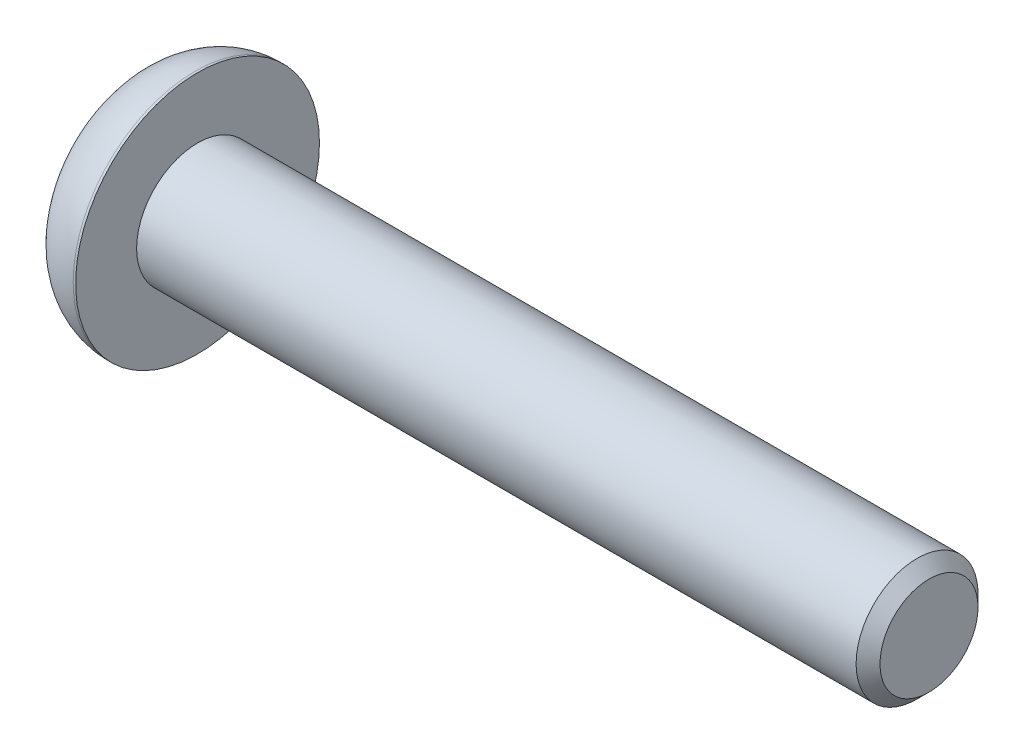
ISO-10303-21;
HEADER;
FILE_DESCRIPTION(('STEP AP214'),'2;1');
FILE_NAME('part.step','',(''),(''),'','','');
FILE_SCHEMA(('AUTOMOTIVE_DESIGN { 1 0 10303 214 1 1 1 1 }'));
ENDSEC;
DATA;
#1=APPLICATION_CONTEXT('core data for automotive mechanical design processes');
#2=APPLICATION_PROTOCOL_DEFINITION('international standard','automotive_design',2000,#1);
#3=PRODUCT_CONTEXT('',#1,'mechanical');
#4=PRODUCT('Part','Part','',(#3));
#5=PRODUCT_RELATED_PRODUCT_CATEGORY('part','',(#4));
#6=PRODUCT_DEFINITION_FORMATION('','',#4);
#7=PRODUCT_DEFINITION_CONTEXT('part definition',#1,'design');
#8=PRODUCT_DEFINITION('design','',#6,#7);
#9=PRODUCT_DEFINITION_SHAPE('','',#8);
#10=(LENGTH_UNIT() NAMED_UNIT(*) SI_UNIT(.MILLI.,.METRE.));
#11=(NAMED_UNIT(*) PLANE_ANGLE_UNIT() SI_UNIT($,.RADIAN.));
#12=(NAMED_UNIT(*) SI_UNIT($,.STERADIAN.) SOLID_ANGLE_UNIT());
#13=UNCERTAINTY_MEASURE_WITH_UNIT(LENGTH_MEASURE(1.E-05),#10,'distance_accuracy_value','');
#14=(GEOMETRIC_REPRESENTATION_CONTEXT(3) GLOBAL_UNCERTAINTY_ASSIGNED_CONTEXT((#13)) GLOBAL_UNIT_ASSIGNED_CONTEXT((#10,
#11,#12)) REPRESENTATION_CONTEXT('',''));
#15=CARTESIAN_POINT('',(0.,0.,0.));
#16=DIRECTION('',(0.,0.,1.));
#17=DIRECTION('',(1.,0.,0.));
#18=AXIS2_PLACEMENT_3D('',#15,#16,#17);
#19=CARTESIAN_POINT('',(1.82,0.,0.));
#20=DIRECTION('',(-1.,0.,0.));
#21=DIRECTION('',(0.,0.,1.));
#22=AXIS2_PLACEMENT_3D('',#19,#20,#21);
#23=PLANE('',#22);
#24=CARTESIAN_POINT('',(1.82,0.,0.));
#25=DIRECTION('',(-1.,0.,0.));
#26=DIRECTION('',(0.,0.,1.));
#27=AXIS2_PLACEMENT_3D('',#24,#25,#26);
#28=CIRCLE('',#27,1.49999999999999);
#29=CARTESIAN_POINT('',(1.82,0.,1.49999999999999));
#30=VERTEX_POINT('',#29);
#31=CARTESIAN_POINT('',(1.82,1.29903810567665,0.749999999999996));
#32=VERTEX_POINT('',#31);
#33=EDGE_CURVE('E120',#30,#32,#28,.T.);
#34=ORIENTED_EDGE('',*,*,#33,.F.);
#35=DIRECTION('',(0.,1.,0.));
#36=VECTOR('',#35,1.);
#37=CARTESIAN_POINT('',(1.82,-0.866025403784439,1.5));
#38=LINE('',#37,#36);
#39=CARTESIAN_POINT('',(1.82,0.866025403784439,1.5));
#40=VERTEX_POINT('',#39);
#41=EDGE_CURVE('E131',#30,#40,#38,.T.);
#42=ORIENTED_EDGE('',*,*,#41,.T.);
#43=DIRECTION('',(0.,0.500000000000001,-0.866025403784438));
#44=VECTOR('',#43,1.);
#45=CARTESIAN_POINT('',(1.82,0.866025403784439,1.5));
#46=LINE('',#45,#44);
#47=EDGE_CURVE('E137',#40,#32,#46,.T.);
#48=ORIENTED_EDGE('',*,*,#47,.T.);
#49=EDGE_LOOP('',(#34,#42,#48));
#50=FACE_BOUND('',#49,.T.);
#51=ADVANCED_FACE('F37',(#50),#23,.T.);
#52=CARTESIAN_POINT('',(1.82,1.29903810567665,-0.749999999999996));
#53=VERTEX_POINT('',#52);
#54=EDGE_CURVE('E125',#32,#53,#28,.T.);
#55=ORIENTED_EDGE('',*,*,#54,.F.);
#56=CARTESIAN_POINT('',(1.82,1.73205080756888,0.));
#57=VERTEX_POINT('',#56);
#58=EDGE_CURVE('E136',#32,#57,#46,.T.);
#59=ORIENTED_EDGE('',*,*,#58,.T.);
#60=DIRECTION('',(0.,-0.500000000000001,-0.866025403784438));
#61=VECTOR('',#60,1.);
#62=CARTESIAN_POINT('',(1.82,1.73205080756888,0.));
#63=LINE('',#62,#61);
#64=EDGE_CURVE('E141',#57,#53,#63,.T.);
#65=ORIENTED_EDGE('',*,*,#64,.T.);
#66=EDGE_LOOP('',(#55,#59,#65));
#67=FACE_BOUND('',#66,.T.);
#68=ADVANCED_FACE('F204',(#67),#23,.T.);
#69=CARTESIAN_POINT('',(1.82,0.,-1.49999999999999));
#70=VERTEX_POINT('',#69);
#71=EDGE_CURVE('E265',#53,#70,#28,.T.);
#72=ORIENTED_EDGE('',*,*,#71,.F.);
#73=CARTESIAN_POINT('',(1.82,0.86602540378444,-1.5));
#74=VERTEX_POINT('',#73);
#75=EDGE_CURVE('E140',#53,#74,#63,.T.);
#76=ORIENTED_EDGE('',*,*,#75,.T.);
#77=DIRECTION('',(0.,-1.,0.));
#78=VECTOR('',#77,1.);
#79=CARTESIAN_POINT('',(1.82,0.86602540378444,-1.5));
#80=LINE('',#79,#78);
#81=EDGE_CURVE('E145',#74,#70,#80,.T.);
#82=ORIENTED_EDGE('',*,*,#81,.T.);
#83=EDGE_LOOP('',(#72,#76,#82));
#84=FACE_BOUND('',#83,.T.);
#85=ADVANCED_FACE('F210',(#84),#23,.T.);
#86=CARTESIAN_POINT('',(1.82,-1.29903810567665,-0.749999999999994));
#87=VERTEX_POINT('',#86);
#88=EDGE_CURVE('E237',#70,#87,#28,.T.);
#89=ORIENTED_EDGE('',*,*,#88,.F.);
#90=CARTESIAN_POINT('',(1.82,-0.866025403784439,-1.5));
#91=VERTEX_POINT('',#90);
#92=EDGE_CURVE('E144',#70,#91,#80,.T.);
#93=ORIENTED_EDGE('',*,*,#92,.T.);
#94=DIRECTION('',(0.,-0.5,0.866025403784439));
#95=VECTOR('',#94,1.);
#96=CARTESIAN_POINT('',(1.82,-0.866025403784439,-1.5));
#97=LINE('',#96,#95);
#98=EDGE_CURVE('E149',#91,#87,#97,.T.);
#99=ORIENTED_EDGE('',*,*,#98,.T.);
#100=EDGE_LOOP('',(#89,#93,#99));
#101=FACE_BOUND('',#100,.T.);
#102=ADVANCED_FACE('F225',(#101),#23,.T.);
#103=CARTESIAN_POINT('',(1.82,-1.29903810567666,0.750000000000002));
#104=VERTEX_POINT('',#103);
#105=EDGE_CURVE('E52',#87,#104,#28,.T.);
#106=ORIENTED_EDGE('',*,*,#105,.F.);
#107=CARTESIAN_POINT('',(1.82,-1.73205080756888,0.));
#108=VERTEX_POINT('',#107);
#109=EDGE_CURVE('E148',#87,#108,#97,.T.);
#110=ORIENTED_EDGE('',*,*,#109,.T.);
#111=DIRECTION('',(0.,0.500000000000001,0.866025403784438));
#112=VECTOR('',#111,1.);
#113=CARTESIAN_POINT('',(1.82,-1.73205080756888,0.));
#114=LINE('',#113,#112);
#115=EDGE_CURVE('E128',#108,#104,#114,.T.);
#116=ORIENTED_EDGE('',*,*,#115,.T.);
#117=EDGE_LOOP('',(#106,#110,#116));
#118=FACE_BOUND('',#117,.T.);
#119=ADVANCED_FACE('F217',(#118),#23,.T.);
#120=CARTESIAN_POINT('',(0.,0.,0.));
#121=DIRECTION('',(1.,0.,0.));
#122=DIRECTION('',(0.,0.,-1.));
#123=AXIS2_PLACEMENT_3D('',#120,#121,#122);
#124=CYLINDRICAL_SURFACE('',#123,5.);
#125=CARTESIAN_POINT('',(2.7,0.,0.));
#126=DIRECTION('',(-1.,0.,0.));
#127=DIRECTION('',(0.,0.,1.));
#128=AXIS2_PLACEMENT_3D('',#125,#126,#127);
#129=CIRCLE('',#128,5.);
#130=CARTESIAN_POINT('',(2.7,0.,5.));
#131=VERTEX_POINT('',#130);
#132=EDGE_CURVE('E45',#131,#131,#129,.F.);
#133=ORIENTED_EDGE('',*,*,#132,.T.);
#134=EDGE_LOOP('',(#133));
#135=FACE_BOUND('',#134,.T.);
#136=CARTESIAN_POINT('',(2.8,0.,0.));
#137=DIRECTION('',(1.,0.,0.));
#138=DIRECTION('',(0.,0.,-1.));
#139=AXIS2_PLACEMENT_3D('',#136,#137,#138);
#140=CIRCLE('',#139,5.);
#141=CARTESIAN_POINT('',(2.8,0.,-5.));
#142=VERTEX_POINT('',#141);
#143=EDGE_CURVE('E169',#142,#142,#140,.T.);
#144=ORIENTED_EDGE('',*,*,#143,.F.);
#145=EDGE_LOOP('',(#144));
#146=FACE_BOUND('',#145,.T.);
#147=ADVANCED_FACE('F192',(#135,#146),#124,.T.);
#148=CARTESIAN_POINT('',(0.,5.,0.));
#149=DIRECTION('',(-1.,0.,0.));
#150=DIRECTION('',(0.,0.,1.));
#151=AXIS2_PLACEMENT_3D('',#148,#149,#150);
#152=PLANE('',#151);
#153=CARTESIAN_POINT('',(0.,0.,0.));
#154=DIRECTION('',(-1.,0.,0.));
#155=DIRECTION('',(0.,0.,1.));
#156=AXIS2_PLACEMENT_3D('',#153,#154,#155);
#157=CIRCLE('',#156,2.3);
#158=CARTESIAN_POINT('',(0.,0.,2.3));
#159=VERTEX_POINT('',#158);
#160=EDGE_CURVE('E11',#159,#159,#157,.T.);
#161=ORIENTED_EDGE('',*,*,#160,.T.);
#162=EDGE_LOOP('',(#161));
#163=FACE_BOUND('',#162,.T.);
#164=DIRECTION('',(0.,0.500000000000001,0.866025403784438));
#165=VECTOR('',#164,1.);
#166=CARTESIAN_POINT('',(0.,-1.73205080756888,0.));
#167=LINE('',#166,#165);
#168=CARTESIAN_POINT('',(0.,-1.73205080756888,0.));
#169=VERTEX_POINT('',#168);
#170=CARTESIAN_POINT('',(0.,-0.866025403784439,1.5));
#171=VERTEX_POINT('',#170);
#172=EDGE_CURVE('E60',#169,#171,#167,.T.);
#173=ORIENTED_EDGE('',*,*,#172,.F.);
#174=DIRECTION('',(0.,-0.5,0.866025403784439));
#175=VECTOR('',#174,1.);
#176=CARTESIAN_POINT('',(0.,-0.866025403784439,-1.5));
#177=LINE('',#176,#175);
#178=CARTESIAN_POINT('',(0.,-0.866025403784439,-1.5));
#179=VERTEX_POINT('',#178);
#180=EDGE_CURVE('E164',#179,#169,#177,.T.);
#181=ORIENTED_EDGE('',*,*,#180,.F.);
#182=DIRECTION('',(0.,-1.,0.));
#183=VECTOR('',#182,1.);
#184=CARTESIAN_POINT('',(0.,0.86602540378444,-1.5));
#185=LINE('',#184,#183);
#186=CARTESIAN_POINT('',(0.,0.86602540378444,-1.5));
#187=VERTEX_POINT('',#186);
#188=EDGE_CURVE('E161',#187,#179,#185,.T.);
#189=ORIENTED_EDGE('',*,*,#188,.F.);
#190=DIRECTION('',(0.,-0.500000000000001,-0.866025403784438));
#191=VECTOR('',#190,1.);
#192=CARTESIAN_POINT('',(0.,1.73205080756888,0.));
#193=LINE('',#192,#191);
#194=CARTESIAN_POINT('',(0.,1.73205080756888,0.));
#195=VERTEX_POINT('',#194);
#196=EDGE_CURVE('E158',#195,#187,#193,.T.);
#197=ORIENTED_EDGE('',*,*,#196,.F.);
#198=DIRECTION('',(0.,0.500000000000001,-0.866025403784438));
#199=VECTOR('',#198,1.);
#200=CARTESIAN_POINT('',(0.,0.866025403784439,1.5));
#201=LINE('',#200,#199);
#202=CARTESIAN_POINT('',(0.,0.866025403784439,1.5));
#203=VERTEX_POINT('',#202);
#204=EDGE_CURVE('E155',#203,#195,#201,.T.);
#205=ORIENTED_EDGE('',*,*,#204,.F.);
#206=DIRECTION('',(0.,1.,0.));
#207=VECTOR('',#206,1.);
#208=CARTESIAN_POINT('',(0.,-0.866025403784439,1.5));
#209=LINE('',#208,#207);
#210=EDGE_CURVE('E122',#171,#203,#209,.T.);
#211=ORIENTED_EDGE('',*,*,#210,.F.);
#212=EDGE_LOOP('',(#173,#181,#189,#197,#205,#211));
#213=FACE_BOUND('',#212,.T.);
#214=ADVANCED_FACE('F231',(#163,#213),#152,.T.);
#215=CARTESIAN_POINT('',(2.8,0.,0.));
#216=DIRECTION('',(1.,0.,0.));
#217=DIRECTION('',(0.,0.,-1.));
#218=AXIS2_PLACEMENT_3D('',#215,#216,#217);
#219=PLANE('',#218);
#220=CARTESIAN_POINT('',(2.8,0.,0.));
#221=DIRECTION('',(1.,0.,0.));
#222=DIRECTION('',(0.,0.,-1.));
#223=AXIS2_PLACEMENT_3D('',#220,#221,#222);
#224=CIRCLE('',#223,2.5);
#225=CARTESIAN_POINT('',(2.8,0.,2.5));
#226=VERTEX_POINT('',#225);
#227=EDGE_CURVE('E179',#226,#226,#224,.T.);
#228=ORIENTED_EDGE('',*,*,#227,.F.);
#229=EDGE_LOOP('',(#228));
#230=FACE_BOUND('',#229,.T.);
#231=ORIENTED_EDGE('',*,*,#143,.T.);
#232=EDGE_LOOP('',(#231));
#233=FACE_BOUND('',#232,.T.);
#234=ADVANCED_FACE('F289',(#230,#233),#219,.T.);
#235=CARTESIAN_POINT('',(32.8,0.,0.));
#236=DIRECTION('',(-1.,0.,0.));
#237=DIRECTION('',(0.,0.,1.));
#238=AXIS2_PLACEMENT_3D('',#235,#236,#237);
#239=CYLINDRICAL_SURFACE('',#238,2.5);
#240=CARTESIAN_POINT('',(32.30949999996,0.,0.));
#241=DIRECTION('',(1.,0.,0.));
#242=DIRECTION('',(0.,0.,-1.));
#243=AXIS2_PLACEMENT_3D('',#240,#241,#242);
#244=CIRCLE('',#243,2.5);
#245=CARTESIAN_POINT('',(32.30949999996,0.,2.5));
#246=VERTEX_POINT('',#245);
#247=EDGE_CURVE('E187',#246,#246,#244,.F.);
#248=CARTESIAN_POINT('',(32.30949999996,0.,2.5));
#249=CARTESIAN_POINT('',(32.0021093749604,0.,2.5));
#250=CARTESIAN_POINT('',(31.6947187499608,0.,2.5));
#251=CARTESIAN_POINT('',(31.0799374999616,0.,2.5));
#252=CARTESIAN_POINT('',(30.772546874962,0.,2.5));
#253=CARTESIAN_POINT('',(30.1577656249629,0.,2.5));
#254=CARTESIAN_POINT('',(29.8503749999633,0.,2.5));
#255=CARTESIAN_POINT('',(29.2355937499641,0.,2.5));
#256=CARTESIAN_POINT('',(28.9282031249646,0.,2.5));
#257=CARTESIAN_POINT('',(28.3134218749654,0.,2.5));
#258=CARTESIAN_POINT('',(28.0060312499658,0.,2.5));
#259=CARTESIAN_POINT('',(27.3912499999666,0.,2.5));
#260=CARTESIAN_POINT('',(27.0838593749671,0.,2.5));
#261=CARTESIAN_POINT('',(26.4690781249679,0.,2.5));
#262=CARTESIAN_POINT('',(26.1616874999683,0.,2.5));
#263=CARTESIAN_POINT('',(25.5469062499691,0.,2.5));
#264=CARTESIAN_POINT('',(25.2395156249696,0.,2.5));
#265=CARTESIAN_POINT('',(24.6247343749704,0.,2.5));
#266=CARTESIAN_POINT('',(24.3173437499708,0.,2.5));
#267=CARTESIAN_POINT('',(23.7025624999716,0.,2.5));
#268=CARTESIAN_POINT('',(23.3951718749721,0.,2.5));
#269=CARTESIAN_POINT('',(22.7803906249729,0.,2.5));
#270=CARTESIAN_POINT('',(22.4729999999733,0.,2.5));
#271=CARTESIAN_POINT('',(21.8582187499741,0.,2.5));
#272=CARTESIAN_POINT('',(21.5508281249746,0.,2.5));
#273=CARTESIAN_POINT('',(20.9360468749754,0.,2.5));
#274=CARTESIAN_POINT('',(20.6286562499758,0.,2.5));
#275=CARTESIAN_POINT('',(20.0138749999766,0.,2.5));
#276=CARTESIAN_POINT('',(19.7064843749771,0.,2.5));
#277=CARTESIAN_POINT('',(19.0917031249779,0.,2.5));
#278=CARTESIAN_POINT('',(18.7843124999783,0.,2.5));
#279=CARTESIAN_POINT('',(18.1695312499791,0.,2.5));
#280=CARTESIAN_POINT('',(17.8621406249796,0.,2.5));
#281=CARTESIAN_POINT('',(17.2473593749804,0.,2.5));
#282=CARTESIAN_POINT('',(16.9399687499808,0.,2.5));
#283=CARTESIAN_POINT('',(16.3251874999817,0.,2.5));
#284=CARTESIAN_POINT('',(16.0177968749821,0.,2.5));
#285=CARTESIAN_POINT('',(15.4030156249829,0.,2.5));
#286=CARTESIAN_POINT('',(15.0956249999833,0.,2.5));
#287=CARTESIAN_POINT('',(14.4808437499842,0.,2.5));
#288=CARTESIAN_POINT('',(14.1734531249846,0.,2.5));
#289=CARTESIAN_POINT('',(13.5586718749854,0.,2.5));
#290=CARTESIAN_POINT('',(13.2512812499858,0.,2.5));
#291=CARTESIAN_POINT('',(12.6364999999867,0.,2.5));
#292=CARTESIAN_POINT('',(12.3291093749871,0.,2.5));
#293=CARTESIAN_POINT('',(11.7143281249879,0.,2.5));
#294=CARTESIAN_POINT('',(11.4069374999883,0.,2.5));
#295=CARTESIAN_POINT('',(10.7921562499892,0.,2.5));
#296=CARTESIAN_POINT('',(10.4847656249896,0.,2.5));
#297=CARTESIAN_POINT('',(9.86998437499041,0.,2.5));
#298=CARTESIAN_POINT('',(9.56259374999083,0.,2.5));
#299=CARTESIAN_POINT('',(8.94781249999166,0.,2.5));
#300=CARTESIAN_POINT('',(8.64042187499208,0.,2.5));
#301=CARTESIAN_POINT('',(8.02564062499291,0.,2.5));
#302=CARTESIAN_POINT('',(7.71824999999333,0.,2.5));
#303=CARTESIAN_POINT('',(7.10346874999416,0.,2.5));
#304=CARTESIAN_POINT('',(6.79607812499458,0.,2.5));
#305=CARTESIAN_POINT('',(6.18129687499541,0.,2.5));
#306=CARTESIAN_POINT('',(5.87390624999583,0.,2.5));
#307=CARTESIAN_POINT('',(5.25912499999666,0.,2.5));
#308=CARTESIAN_POINT('',(4.95173437499708,0.,2.5));
#309=CARTESIAN_POINT('',(4.33695312499791,0.,2.5));
#310=CARTESIAN_POINT('',(4.02956249999833,0.,2.5));
#311=CARTESIAN_POINT('',(3.41478124999917,0.,2.5));
#312=CARTESIAN_POINT('',(3.10739062499958,0.,2.5));
#313=CARTESIAN_POINT('',(2.8,0.,2.5));
#314=B_SPLINE_CURVE_WITH_KNOTS('',3,(#248,#249,#250,#251,#252,#253,#254,#255,#256,#257,#258,
#259,#260,#261,#262,#263,#264,#265,#266,#267,#268,#269,#270,#271,#272,#273,#274,#275,#276,#277,
#278,#279,#280,#281,#282,#283,#284,#285,#286,#287,#288,#289,#290,#291,#292,#293,#294,#295,#296,
#297,#298,#299,#300,#301,#302,#303,#304,#305,#306,#307,#308,#309,#310,#311,#312,#313),
.UNSPECIFIED.,.F.,.F.,(4,2,2,2,2,2,2,2,2,2,2,2,2,2,2,2,2,2,2,2,2,2,2,2,2,2,2,2,2,2,2,2,4),(0.,
0.922171874998746,1.84434374999749,2.76651562499624,3.68868749999499,4.61085937499374,
5.53303124999249,6.45520312499124,7.37737499998999,8.29954687498874,9.22171874998749,
10.1438906249862,11.066062499985,11.9882343749837,12.9104062499825,13.8325781249812,
14.75474999998,15.6769218749787,16.5990937499775,17.5212656249762,18.443437499975,
19.3656093749737,20.2877812499725,21.2099531249712,22.13212499997,23.0542968749687,
23.9764687499675,24.8986406249662,25.820812499965,26.7429843749637,27.6651562499625,
28.5873281249612,29.50949999996),.UNSPECIFIED.);
#315=EDGE_CURVE('BSEAM285',#246,#226,#314,.T.);
#316=ORIENTED_EDGE('',*,*,#247,.T.);
#317=ORIENTED_EDGE('',*,*,#227,.T.);
#318=ORIENTED_EDGE('',*,*,#315,.T.);
#319=ORIENTED_EDGE('',*,*,#315,.F.);
#320=EDGE_LOOP('',(#316,#318,#317,#319));
#321=FACE_BOUND('',#320,.T.);
#322=ADVANCED_FACE('F285',(#321),#239,.T.);
#323=CARTESIAN_POINT('',(32.8,0.,0.));
#324=DIRECTION('',(1.,0.,0.));
#325=DIRECTION('',(0.,0.,-1.));
#326=AXIS2_PLACEMENT_3D('',#323,#324,#325);
#327=PLANE('',#326);
#328=CARTESIAN_POINT('',(32.8,0.,0.));
#329=DIRECTION('',(1.,0.,0.));
#330=DIRECTION('',(0.,0.,-1.));
#331=AXIS2_PLACEMENT_3D('',#328,#329,#330);
#332=CIRCLE('',#331,2.00950000001682);
#333=CARTESIAN_POINT('',(32.8,0.,-2.00950000001682));
#334=VERTEX_POINT('',#333);
#335=EDGE_CURVE('E184',#334,#334,#332,.T.);
#336=ORIENTED_EDGE('',*,*,#335,.T.);
#337=EDGE_LOOP('',(#336));
#338=FACE_BOUND('',#337,.T.);
#339=ADVANCED_FACE('F282',(#338),#327,.T.);
#340=CARTESIAN_POINT('',(1.82,-1.73205080756888,0.));
#341=DIRECTION('',(0.,-0.866025403784438,0.500000000000001));
#342=DIRECTION('',(0.,-0.500000000000001,-0.866025403784438));
#343=AXIS2_PLACEMENT_3D('',#340,#341,#342);
#344=PLANE('',#343);
#345=ORIENTED_EDGE('',*,*,#172,.T.);
#346=DIRECTION('',(-1.,0.,0.));
#347=VECTOR('',#346,1.);
#348=CARTESIAN_POINT('',(1.82,-0.866025403784439,1.5));
#349=LINE('',#348,#347);
#350=CARTESIAN_POINT('',(1.82,-0.866025403784439,1.5));
#351=VERTEX_POINT('',#350);
#352=EDGE_CURVE('E151',#351,#171,#349,.T.);
#353=ORIENTED_EDGE('',*,*,#352,.F.);
#354=EDGE_CURVE('E132',#104,#351,#114,.T.);
#355=ORIENTED_EDGE('',*,*,#354,.F.);
#356=ORIENTED_EDGE('',*,*,#115,.F.);
#357=DIRECTION('',(-1.,0.,0.));
#358=VECTOR('',#357,1.);
#359=CARTESIAN_POINT('',(1.82,-1.73205080756888,0.));
#360=LINE('',#359,#358);
#361=EDGE_CURVE('E167',#108,#169,#360,.T.);
#362=ORIENTED_EDGE('',*,*,#361,.T.);
#363=EDGE_LOOP('',(#345,#353,#355,#356,#362));
#364=FACE_BOUND('',#363,.T.);
#365=ADVANCED_FACE('F258',(#364),#344,.F.);
#366=CARTESIAN_POINT('',(1.82,-0.866025403784439,-1.5));
#367=DIRECTION('',(0.,-0.866025403784439,-0.5));
#368=DIRECTION('',(0.,0.5,-0.866025403784439));
#369=AXIS2_PLACEMENT_3D('',#366,#367,#368);
#370=PLANE('',#369);
#371=ORIENTED_EDGE('',*,*,#180,.T.);
#372=ORIENTED_EDGE('',*,*,#361,.F.);
#373=ORIENTED_EDGE('',*,*,#109,.F.);
#374=ORIENTED_EDGE('',*,*,#98,.F.);
#375=DIRECTION('',(-1.,0.,0.));
#376=VECTOR('',#375,1.);
#377=CARTESIAN_POINT('',(1.82,-0.866025403784439,-1.5));
#378=LINE('',#377,#376);
#379=EDGE_CURVE('E170',#91,#179,#378,.T.);
#380=ORIENTED_EDGE('',*,*,#379,.T.);
#381=EDGE_LOOP('',(#371,#372,#373,#374,#380));
#382=FACE_BOUND('',#381,.T.);
#383=ADVANCED_FACE('F240',(#382),#370,.F.);
#384=CARTESIAN_POINT('',(1.82,0.86602540378444,-1.5));
#385=DIRECTION('',(0.,0.,-1.));
#386=DIRECTION('',(0.,1.,0.));
#387=AXIS2_PLACEMENT_3D('',#384,#385,#386);
#388=PLANE('',#387);
#389=ORIENTED_EDGE('',*,*,#188,.T.);
#390=ORIENTED_EDGE('',*,*,#379,.F.);
#391=ORIENTED_EDGE('',*,*,#92,.F.);
#392=ORIENTED_EDGE('',*,*,#81,.F.);
#393=DIRECTION('',(-1.,0.,0.));
#394=VECTOR('',#393,1.);
#395=CARTESIAN_POINT('',(1.82,0.86602540378444,-1.5));
#396=LINE('',#395,#394);
#397=EDGE_CURVE('E172',#74,#187,#396,.T.);
#398=ORIENTED_EDGE('',*,*,#397,.T.);
#399=EDGE_LOOP('',(#389,#390,#391,#392,#398));
#400=FACE_BOUND('',#399,.T.);
#401=ADVANCED_FACE('F246',(#400),#388,.F.);
#402=CARTESIAN_POINT('',(1.82,1.73205080756888,0.));
#403=DIRECTION('',(0.,0.866025403784438,-0.500000000000001));
#404=DIRECTION('',(0.,0.500000000000001,0.866025403784438));
#405=AXIS2_PLACEMENT_3D('',#402,#403,#404);
#406=PLANE('',#405);
#407=ORIENTED_EDGE('',*,*,#196,.T.);
#408=ORIENTED_EDGE('',*,*,#397,.F.);
#409=ORIENTED_EDGE('',*,*,#75,.F.);
#410=ORIENTED_EDGE('',*,*,#64,.F.);
#411=DIRECTION('',(-1.,0.,0.));
#412=VECTOR('',#411,1.);
#413=CARTESIAN_POINT('',(1.82,1.73205080756888,0.));
#414=LINE('',#413,#412);
#415=EDGE_CURVE('E174',#57,#195,#414,.T.);
#416=ORIENTED_EDGE('',*,*,#415,.T.);
#417=EDGE_LOOP('',(#407,#408,#409,#410,#416));
#418=FACE_BOUND('',#417,.T.);
#419=ADVANCED_FACE('F270',(#418),#406,.F.);
#420=CARTESIAN_POINT('',(1.82,0.866025403784439,1.5));
#421=DIRECTION('',(0.,0.866025403784438,0.500000000000001));
#422=DIRECTION('',(0.,-0.500000000000001,0.866025403784438));
#423=AXIS2_PLACEMENT_3D('',#420,#421,#422);
#424=PLANE('',#423);
#425=ORIENTED_EDGE('',*,*,#204,.T.);
#426=ORIENTED_EDGE('',*,*,#415,.F.);
#427=ORIENTED_EDGE('',*,*,#58,.F.);
#428=ORIENTED_EDGE('',*,*,#47,.F.);
#429=DIRECTION('',(-1.,0.,0.));
#430=VECTOR('',#429,1.);
#431=CARTESIAN_POINT('',(1.82,0.866025403784439,1.5));
#432=LINE('',#431,#430);
#433=EDGE_CURVE('E176',#40,#203,#432,.T.);
#434=ORIENTED_EDGE('',*,*,#433,.T.);
#435=EDGE_LOOP('',(#425,#426,#427,#428,#434));
#436=FACE_BOUND('',#435,.T.);
#437=ADVANCED_FACE('F221',(#436),#424,.F.);
#438=CARTESIAN_POINT('',(1.82,-0.866025403784439,1.5));
#439=DIRECTION('',(0.,0.,1.));
#440=DIRECTION('',(1.,0.,0.));
#441=AXIS2_PLACEMENT_3D('',#438,#439,#440);
#442=PLANE('',#441);
#443=ORIENTED_EDGE('',*,*,#210,.T.);
#444=ORIENTED_EDGE('',*,*,#433,.F.);
#445=ORIENTED_EDGE('',*,*,#41,.F.);
#446=EDGE_CURVE('E133',#351,#30,#38,.T.);
#447=ORIENTED_EDGE('',*,*,#446,.F.);
#448=ORIENTED_EDGE('',*,*,#352,.T.);
#449=EDGE_LOOP('',(#443,#444,#445,#447,#448));
#450=FACE_BOUND('',#449,.T.);
#451=ADVANCED_FACE('F215',(#450),#442,.F.);
#452=EDGE_CURVE('E126',#104,#30,#28,.T.);
#453=ORIENTED_EDGE('',*,*,#452,.F.);
#454=ORIENTED_EDGE('',*,*,#354,.T.);
#455=ORIENTED_EDGE('',*,*,#446,.T.);
#456=EDGE_LOOP('',(#453,#454,#455));
#457=FACE_BOUND('',#456,.T.);
#458=ADVANCED_FACE('F114',(#457),#23,.T.);
#459=CARTESIAN_POINT('',(1.93397459621555,0.,0.));
#460=DIRECTION('',(-1.,0.,0.));
#461=DIRECTION('',(0.,0.,1.));
#462=AXIS2_PLACEMENT_3D('',#459,#460,#461);
#463=CONICAL_SURFACE('',#462,1.49999999999999,1.04719755099792);
#464=CARTESIAN_POINT('',(2.80000000039734,0.,0.));
#465=VERTEX_POINT('',#464);
#466=VERTEX_LOOP('',#465);
#467=FACE_BOUND('',#466,.T.);
#468=CARTESIAN_POINT('',(1.93397459621555,0.,0.));
#469=DIRECTION('',(-1.,0.,0.));
#470=DIRECTION('',(0.,0.,1.));
#471=AXIS2_PLACEMENT_3D('',#468,#469,#470);
#472=CIRCLE('',#471,1.49999999999999);
#473=CARTESIAN_POINT('',(1.93397459621555,0.,1.49999999999999));
#474=VERTEX_POINT('',#473);
#475=EDGE_CURVE('E118',#474,#474,#472,.T.);
#476=ORIENTED_EDGE('',*,*,#475,.T.);
#477=EDGE_LOOP('',(#476));
#478=FACE_BOUND('',#477,.T.);
#479=ADVANCED_FACE('F110',(#467,#478),#463,.F.);
#480=CARTESIAN_POINT('',(1.82,0.,0.));
#481=DIRECTION('',(-1.,0.,0.));
#482=DIRECTION('',(0.,0.,1.));
#483=AXIS2_PLACEMENT_3D('',#480,#481,#482);
#484=CYLINDRICAL_SURFACE('',#483,1.49999999999999);
#485=ORIENTED_EDGE('',*,*,#475,.F.);
#486=EDGE_LOOP('',(#485));
#487=FACE_BOUND('',#486,.T.);
#488=ORIENTED_EDGE('',*,*,#33,.T.);
#489=ORIENTED_EDGE('',*,*,#54,.T.);
#490=ORIENTED_EDGE('',*,*,#71,.T.);
#491=ORIENTED_EDGE('',*,*,#88,.T.);
#492=ORIENTED_EDGE('',*,*,#105,.T.);
#493=ORIENTED_EDGE('',*,*,#452,.T.);
#494=EDGE_LOOP('',(#488,#489,#490,#491,#492,#493));
#495=FACE_BOUND('',#494,.T.);
#496=ADVANCED_FACE('F113',(#487,#495),#484,.F.);
#497=CARTESIAN_POINT('',(32.8,0.,0.));
#498=DIRECTION('',(-1.,0.,0.));
#499=DIRECTION('',(0.,0.,1.));
#500=AXIS2_PLACEMENT_3D('',#497,#498,#499);
#501=CONICAL_SURFACE('',#500,2.00950000001682,0.785398163339502);
#502=ORIENTED_EDGE('',*,*,#247,.F.);
#503=EDGE_LOOP('',(#502));
#504=FACE_BOUND('',#503,.T.);
#505=ORIENTED_EDGE('',*,*,#335,.F.);
#506=EDGE_LOOP('',(#505));
#507=FACE_BOUND('',#506,.T.);
#508=ADVANCED_FACE('F196',(#504,#507),#501,.T.);
#509=CARTESIAN_POINT('',(2.7,0.,0.));
#510=DIRECTION('',(-1.,0.,0.));
#511=DIRECTION('',(0.,0.,1.));
#512=AXIS2_PLACEMENT_3D('',#509,#510,#511);
#513=DEGENERATE_TOROIDAL_SURFACE('',#512,2.3,2.7,.T.);
#514=ORIENTED_EDGE('',*,*,#160,.F.);
#515=EDGE_LOOP('',(#514));
#516=FACE_BOUND('',#515,.T.);
#517=ORIENTED_EDGE('',*,*,#132,.F.);
#518=EDGE_LOOP('',(#517));
#519=FACE_BOUND('',#518,.T.);
#520=ADVANCED_FACE('F39',(#516,#519),#513,.T.);
#521=CLOSED_SHELL('',(#51,#68,#85,#102,#119,#147,#214,#234,#322,#339,#365,#383,#401,#419,#437,
#451,#458,#479,#496,#508,#520));
#522=MANIFOLD_SOLID_BREP('B2',#521);
#523=ADVANCED_BREP_SHAPE_REPRESENTATION('',(#18,#522),#14);
#524=SHAPE_DEFINITION_REPRESENTATION(#9,#523);
ENDSEC;
END-ISO-10303-21;
